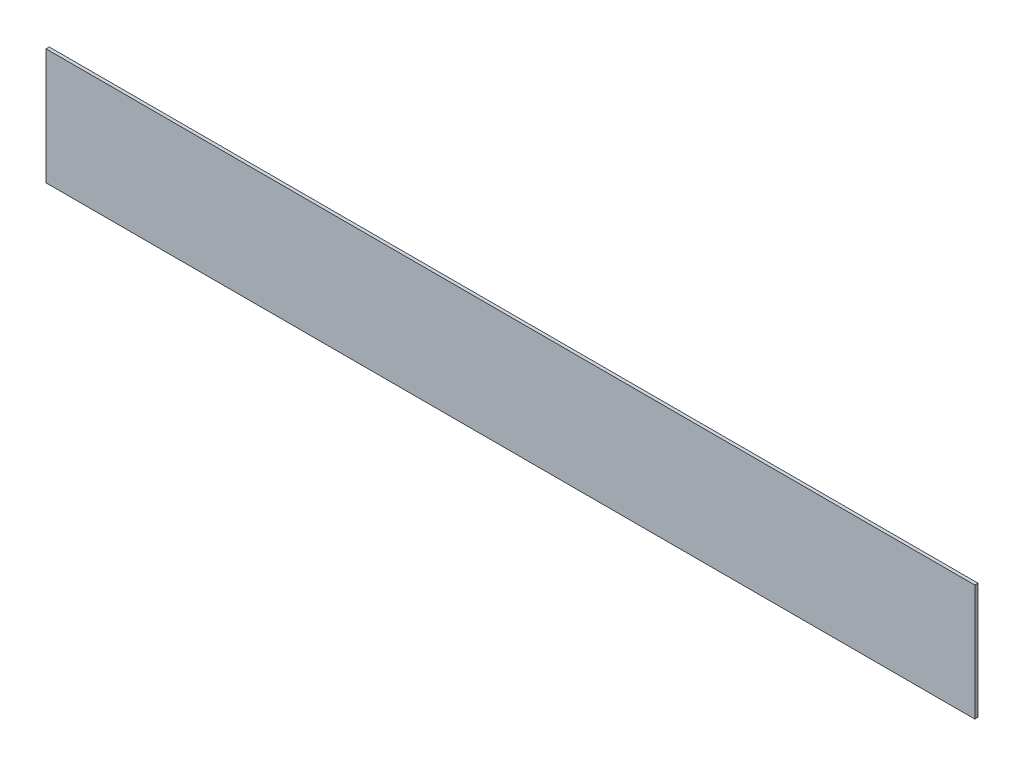
ISO-10303-21;
HEADER;
FILE_DESCRIPTION(('STEP AP214'),'2;1');
FILE_NAME('part.step','',(''),(''),'','','');
FILE_SCHEMA(('AUTOMOTIVE_DESIGN { 1 0 10303 214 1 1 1 1 }'));
ENDSEC;
DATA;
#1=APPLICATION_CONTEXT('core data for automotive mechanical design processes');
#2=APPLICATION_PROTOCOL_DEFINITION('international standard','automotive_design',2000,#1);
#3=PRODUCT_CONTEXT('',#1,'mechanical');
#4=PRODUCT('Part','Part','',(#3));
#5=PRODUCT_RELATED_PRODUCT_CATEGORY('part','',(#4));
#6=PRODUCT_DEFINITION_FORMATION('','',#4);
#7=PRODUCT_DEFINITION_CONTEXT('part definition',#1,'design');
#8=PRODUCT_DEFINITION('design','',#6,#7);
#9=PRODUCT_DEFINITION_SHAPE('','',#8);
#10=(LENGTH_UNIT() NAMED_UNIT(*) SI_UNIT(.MILLI.,.METRE.));
#11=(NAMED_UNIT(*) PLANE_ANGLE_UNIT() SI_UNIT($,.RADIAN.));
#12=(NAMED_UNIT(*) SI_UNIT($,.STERADIAN.) SOLID_ANGLE_UNIT());
#13=UNCERTAINTY_MEASURE_WITH_UNIT(LENGTH_MEASURE(1.E-05),#10,'distance_accuracy_value','');
#14=(GEOMETRIC_REPRESENTATION_CONTEXT(3) GLOBAL_UNCERTAINTY_ASSIGNED_CONTEXT((#13)) GLOBAL_UNIT_ASSIGNED_CONTEXT((#10,
#11,#12)) REPRESENTATION_CONTEXT('',''));
#15=CARTESIAN_POINT('',(0.,0.,0.));
#16=DIRECTION('',(0.,0.,1.));
#17=DIRECTION('',(1.,0.,0.));
#18=AXIS2_PLACEMENT_3D('',#15,#16,#17);
#19=CARTESIAN_POINT('',(0.,0.,3.175));
#20=DIRECTION('',(1.,0.,0.));
#21=DIRECTION('',(0.,0.,-1.));
#22=AXIS2_PLACEMENT_3D('',#19,#20,#21);
#23=PLANE('',#22);
#24=DIRECTION('',(0.,-1.,0.));
#25=VECTOR('',#24,1.);
#26=CARTESIAN_POINT('',(0.,0.,0.));
#27=LINE('',#26,#25);
#28=CARTESIAN_POINT('',(0.,114.3,0.));
#29=VERTEX_POINT('',#28);
#30=CARTESIAN_POINT('',(0.,0.,0.));
#31=VERTEX_POINT('',#30);
#32=EDGE_CURVE('E113',#29,#31,#27,.T.);
#33=ORIENTED_EDGE('',*,*,#32,.T.);
#34=DIRECTION('',(0.,0.,-1.));
#35=VECTOR('',#34,1.);
#36=CARTESIAN_POINT('',(0.,0.,3.175));
#37=LINE('',#36,#35);
#38=CARTESIAN_POINT('',(0.,0.,3.175));
#39=VERTEX_POINT('',#38);
#40=EDGE_CURVE('E11',#39,#31,#37,.T.);
#41=ORIENTED_EDGE('',*,*,#40,.F.);
#42=DIRECTION('',(0.,-1.,0.));
#43=VECTOR('',#42,1.);
#44=CARTESIAN_POINT('',(0.,0.,3.175));
#45=LINE('',#44,#43);
#46=CARTESIAN_POINT('',(0.,114.3,3.175));
#47=VERTEX_POINT('',#46);
#48=EDGE_CURVE('E97',#47,#39,#45,.T.);
#49=ORIENTED_EDGE('',*,*,#48,.F.);
#50=DIRECTION('',(0.,0.,-1.));
#51=VECTOR('',#50,1.);
#52=CARTESIAN_POINT('',(0.,114.3,3.175));
#53=LINE('',#52,#51);
#54=EDGE_CURVE('E109',#47,#29,#53,.T.);
#55=ORIENTED_EDGE('',*,*,#54,.T.);
#56=EDGE_LOOP('',(#33,#41,#49,#55));
#57=FACE_BOUND('',#56,.T.);
#58=ADVANCED_FACE('F45',(#57),#23,.F.);
#59=CARTESIAN_POINT('',(0.,0.,3.175));
#60=DIRECTION('',(0.,1.,0.));
#61=DIRECTION('',(0.,0.,1.));
#62=AXIS2_PLACEMENT_3D('',#59,#60,#61);
#63=PLANE('',#62);
#64=DIRECTION('',(1.,0.,0.));
#65=VECTOR('',#64,1.);
#66=CARTESIAN_POINT('',(0.,0.,0.));
#67=LINE('',#66,#65);
#68=CARTESIAN_POINT('',(914.4,0.,0.));
#69=VERTEX_POINT('',#68);
#70=EDGE_CURVE('E102',#31,#69,#67,.T.);
#71=ORIENTED_EDGE('',*,*,#70,.T.);
#72=DIRECTION('',(0.,0.,-1.));
#73=VECTOR('',#72,1.);
#74=CARTESIAN_POINT('',(914.4,0.,3.175));
#75=LINE('',#74,#73);
#76=CARTESIAN_POINT('',(914.4,0.,3.175));
#77=VERTEX_POINT('',#76);
#78=EDGE_CURVE('E54',#77,#69,#75,.T.);
#79=ORIENTED_EDGE('',*,*,#78,.F.);
#80=DIRECTION('',(1.,0.,0.));
#81=VECTOR('',#80,1.);
#82=CARTESIAN_POINT('',(0.,0.,3.175));
#83=LINE('',#82,#81);
#84=EDGE_CURVE('E92',#39,#77,#83,.T.);
#85=ORIENTED_EDGE('',*,*,#84,.F.);
#86=ORIENTED_EDGE('',*,*,#40,.T.);
#87=EDGE_LOOP('',(#71,#79,#85,#86));
#88=FACE_BOUND('',#87,.T.);
#89=ADVANCED_FACE('F101',(#88),#63,.F.);
#90=CARTESIAN_POINT('',(914.4,0.,3.175));
#91=DIRECTION('',(-1.,0.,0.));
#92=DIRECTION('',(0.,0.,1.));
#93=AXIS2_PLACEMENT_3D('',#90,#91,#92);
#94=PLANE('',#93);
#95=DIRECTION('',(0.,1.,0.));
#96=VECTOR('',#95,1.);
#97=CARTESIAN_POINT('',(914.4,0.,0.));
#98=LINE('',#97,#96);
#99=CARTESIAN_POINT('',(914.4,114.3,0.));
#100=VERTEX_POINT('',#99);
#101=EDGE_CURVE('E79',#69,#100,#98,.T.);
#102=ORIENTED_EDGE('',*,*,#101,.T.);
#103=DIRECTION('',(0.,0.,-1.));
#104=VECTOR('',#103,1.);
#105=CARTESIAN_POINT('',(914.4,114.3,3.175));
#106=LINE('',#105,#104);
#107=CARTESIAN_POINT('',(914.4,114.3,3.175));
#108=VERTEX_POINT('',#107);
#109=EDGE_CURVE('E104',#108,#100,#106,.T.);
#110=ORIENTED_EDGE('',*,*,#109,.F.);
#111=DIRECTION('',(0.,1.,0.));
#112=VECTOR('',#111,1.);
#113=CARTESIAN_POINT('',(914.4,0.,3.175));
#114=LINE('',#113,#112);
#115=EDGE_CURVE('E95',#77,#108,#114,.T.);
#116=ORIENTED_EDGE('',*,*,#115,.F.);
#117=ORIENTED_EDGE('',*,*,#78,.T.);
#118=EDGE_LOOP('',(#102,#110,#116,#117));
#119=FACE_BOUND('',#118,.T.);
#120=ADVANCED_FACE('F105',(#119),#94,.F.);
#121=CARTESIAN_POINT('',(0.,114.3,3.175));
#122=DIRECTION('',(0.,-1.,0.));
#123=DIRECTION('',(0.,0.,-1.));
#124=AXIS2_PLACEMENT_3D('',#121,#122,#123);
#125=PLANE('',#124);
#126=DIRECTION('',(-1.,0.,0.));
#127=VECTOR('',#126,1.);
#128=CARTESIAN_POINT('',(0.,114.3,0.));
#129=LINE('',#128,#127);
#130=EDGE_CURVE('E85',#100,#29,#129,.T.);
#131=ORIENTED_EDGE('',*,*,#130,.T.);
#132=ORIENTED_EDGE('',*,*,#54,.F.);
#133=DIRECTION('',(-1.,0.,0.));
#134=VECTOR('',#133,1.);
#135=CARTESIAN_POINT('',(0.,114.3,3.175));
#136=LINE('',#135,#134);
#137=EDGE_CURVE('E62',#108,#47,#136,.T.);
#138=ORIENTED_EDGE('',*,*,#137,.F.);
#139=ORIENTED_EDGE('',*,*,#109,.T.);
#140=EDGE_LOOP('',(#131,#132,#138,#139));
#141=FACE_BOUND('',#140,.T.);
#142=ADVANCED_FACE('F126',(#141),#125,.F.);
#143=CARTESIAN_POINT('',(0.,0.,3.175));
#144=DIRECTION('',(0.,0.,-1.));
#145=DIRECTION('',(-1.,0.,0.));
#146=AXIS2_PLACEMENT_3D('',#143,#144,#145);
#147=PLANE('',#146);
#148=ORIENTED_EDGE('',*,*,#48,.T.);
#149=ORIENTED_EDGE('',*,*,#84,.T.);
#150=ORIENTED_EDGE('',*,*,#115,.T.);
#151=ORIENTED_EDGE('',*,*,#137,.T.);
#152=EDGE_LOOP('',(#148,#149,#150,#151));
#153=FACE_BOUND('',#152,.T.);
#154=ADVANCED_FACE('F93',(#153),#147,.F.);
#155=CARTESIAN_POINT('',(0.,0.,0.));
#156=DIRECTION('',(0.,0.,-1.));
#157=DIRECTION('',(-1.,0.,0.));
#158=AXIS2_PLACEMENT_3D('',#155,#156,#157);
#159=PLANE('',#158);
#160=ORIENTED_EDGE('',*,*,#32,.F.);
#161=ORIENTED_EDGE('',*,*,#130,.F.);
#162=ORIENTED_EDGE('',*,*,#101,.F.);
#163=ORIENTED_EDGE('',*,*,#70,.F.);
#164=EDGE_LOOP('',(#160,#161,#162,#163));
#165=FACE_BOUND('',#164,.T.);
#166=ADVANCED_FACE('F129',(#165),#159,.T.);
#167=CLOSED_SHELL('',(#58,#89,#120,#142,#154,#166));
#168=MANIFOLD_SOLID_BREP('B2',#167);
#169=ADVANCED_BREP_SHAPE_REPRESENTATION('',(#18,#168),#14);
#170=SHAPE_DEFINITION_REPRESENTATION(#9,#169);
ENDSEC;
END-ISO-10303-21;
